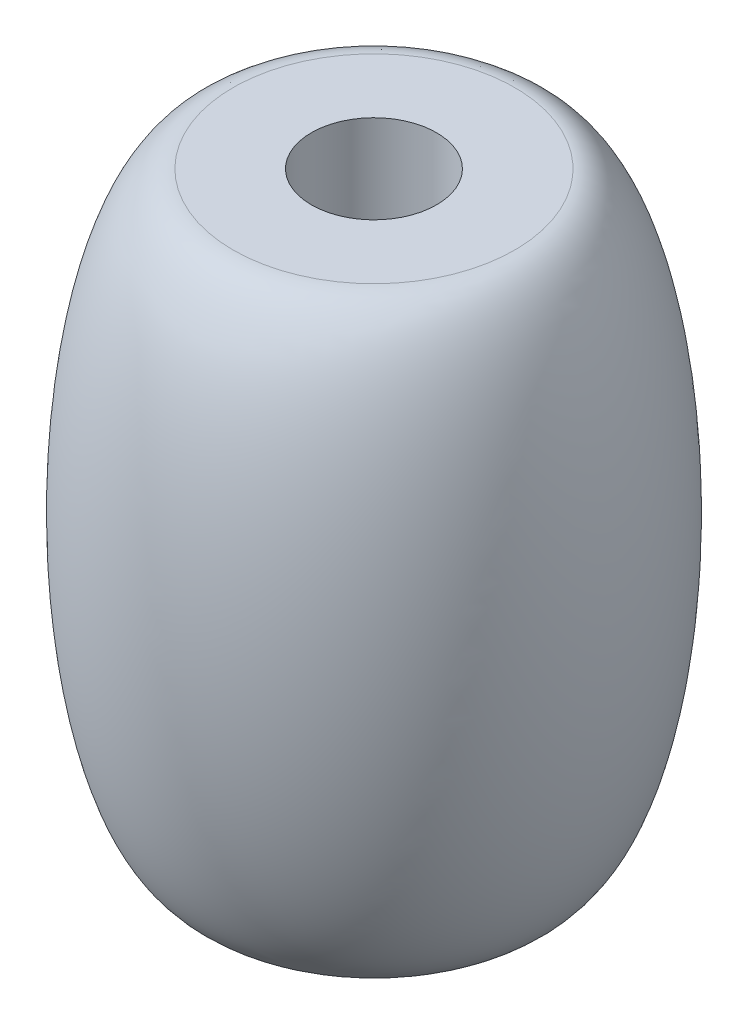
ISO-10303-21;
HEADER;
FILE_DESCRIPTION(('STEP AP214'),'2;1');
FILE_NAME('part.step','',(''),(''),'','','');
FILE_SCHEMA(('AUTOMOTIVE_DESIGN { 1 0 10303 214 1 1 1 1 }'));
ENDSEC;
DATA;
#1=APPLICATION_CONTEXT('core data for automotive mechanical design processes');
#2=APPLICATION_PROTOCOL_DEFINITION('international standard','automotive_design',2000,#1);
#3=PRODUCT_CONTEXT('',#1,'mechanical');
#4=PRODUCT('Part','Part','',(#3));
#5=PRODUCT_RELATED_PRODUCT_CATEGORY('part','',(#4));
#6=PRODUCT_DEFINITION_FORMATION('','',#4);
#7=PRODUCT_DEFINITION_CONTEXT('part definition',#1,'design');
#8=PRODUCT_DEFINITION('design','',#6,#7);
#9=PRODUCT_DEFINITION_SHAPE('','',#8);
#10=(LENGTH_UNIT() NAMED_UNIT(*) SI_UNIT(.MILLI.,.METRE.));
#11=(NAMED_UNIT(*) PLANE_ANGLE_UNIT() SI_UNIT($,.RADIAN.));
#12=(NAMED_UNIT(*) SI_UNIT($,.STERADIAN.) SOLID_ANGLE_UNIT());
#13=UNCERTAINTY_MEASURE_WITH_UNIT(LENGTH_MEASURE(1.E-05),#10,'distance_accuracy_value','');
#14=(GEOMETRIC_REPRESENTATION_CONTEXT(3) GLOBAL_UNCERTAINTY_ASSIGNED_CONTEXT((#13)) GLOBAL_UNIT_ASSIGNED_CONTEXT((#10,
#11,#12)) REPRESENTATION_CONTEXT('',''));
#15=CARTESIAN_POINT('',(0.,0.,0.));
#16=DIRECTION('',(0.,0.,1.));
#17=DIRECTION('',(1.,0.,0.));
#18=AXIS2_PLACEMENT_3D('',#15,#16,#17);
#19=CARTESIAN_POINT('',(-3.07349988963194,6.4885,0.));
#20=DIRECTION('',(0.,1.,0.));
#21=DIRECTION('',(0.,0.,1.));
#22=AXIS2_PLACEMENT_3D('',#19,#20,#21);
#23=PLANE('',#22);
#24=CARTESIAN_POINT('',(0.,6.4885,0.));
#25=DIRECTION('',(0.,1.,0.));
#26=DIRECTION('',(0.,0.,1.));
#27=AXIS2_PLACEMENT_3D('',#24,#25,#26);
#28=CIRCLE('',#27,3.07349988963194);
#29=CARTESIAN_POINT('',(0.,6.4885,3.07349988963194));
#30=VERTEX_POINT('',#29);
#31=EDGE_CURVE('E10',#30,#30,#28,.T.);
#32=ORIENTED_EDGE('',*,*,#31,.T.);
#33=EDGE_LOOP('',(#32));
#34=FACE_BOUND('',#33,.T.);
#35=CARTESIAN_POINT('',(0.,6.4885,0.));
#36=DIRECTION('',(0.,1.,0.));
#37=DIRECTION('',(0.,0.,1.));
#38=AXIS2_PLACEMENT_3D('',#35,#36,#37);
#39=CIRCLE('',#38,1.366);
#40=CARTESIAN_POINT('',(0.,6.4885,1.366));
#41=VERTEX_POINT('',#40);
#42=EDGE_CURVE('E58',#41,#41,#39,.T.);
#43=ORIENTED_EDGE('',*,*,#42,.F.);
#44=EDGE_LOOP('',(#43));
#45=FACE_BOUND('',#44,.T.);
#46=ADVANCED_FACE('F41',(#34,#45),#23,.T.);
#47=CARTESIAN_POINT('',(-3.07349996198817,0.,0.));
#48=DIRECTION('',(0.,0.,1.));
#49=DIRECTION('',(0.,-1.,0.));
#50=AXIS2_PLACEMENT_3D('',#47,#48,#49);
#51=ELLIPSE('',#50,6.4885,1.98177067184012);
#52=CARTESIAN_POINT('',(0.,10.1511574717505,0.));
#53=DIRECTION('',(0.,1.,0.));
#54=AXIS1_PLACEMENT('',#52,#53);
#55=SURFACE_OF_REVOLUTION('',#51,#54);
#56=CARTESIAN_POINT('',(0.,-6.4885,0.));
#57=DIRECTION('',(0.,1.,0.));
#58=DIRECTION('',(0.,0.,1.));
#59=AXIS2_PLACEMENT_3D('',#56,#57,#58);
#60=CIRCLE('',#59,3.07349988963194);
#61=CARTESIAN_POINT('',(0.,-6.4885,3.07349988963194));
#62=VERTEX_POINT('',#61);
#63=EDGE_CURVE('E48',#62,#62,#60,.T.);
#64=ORIENTED_EDGE('',*,*,#63,.T.);
#65=EDGE_LOOP('',(#64));
#66=FACE_BOUND('',#65,.T.);
#67=ORIENTED_EDGE('',*,*,#31,.F.);
#68=EDGE_LOOP('',(#67));
#69=FACE_BOUND('',#68,.T.);
#70=ADVANCED_FACE('F65',(#66,#69),#55,.F.);
#71=CARTESIAN_POINT('',(-1.366,-6.4885,0.));
#72=DIRECTION('',(0.,-1.,0.));
#73=DIRECTION('',(0.,0.,-1.));
#74=AXIS2_PLACEMENT_3D('',#71,#72,#73);
#75=PLANE('',#74);
#76=CARTESIAN_POINT('',(0.,-6.4885,0.));
#77=DIRECTION('',(0.,1.,0.));
#78=DIRECTION('',(0.,0.,1.));
#79=AXIS2_PLACEMENT_3D('',#76,#77,#78);
#80=CIRCLE('',#79,1.366);
#81=CARTESIAN_POINT('',(0.,-6.4885,1.366));
#82=VERTEX_POINT('',#81);
#83=EDGE_CURVE('E53',#82,#82,#80,.T.);
#84=ORIENTED_EDGE('',*,*,#83,.T.);
#85=EDGE_LOOP('',(#84));
#86=FACE_BOUND('',#85,.T.);
#87=ORIENTED_EDGE('',*,*,#63,.F.);
#88=EDGE_LOOP('',(#87));
#89=FACE_BOUND('',#88,.T.);
#90=ADVANCED_FACE('F68',(#86,#89),#75,.T.);
#91=CARTESIAN_POINT('',(0.,10.1511574717505,0.));
#92=DIRECTION('',(0.,1.,0.));
#93=DIRECTION('',(0.,0.,1.));
#94=AXIS2_PLACEMENT_3D('',#91,#92,#93);
#95=CYLINDRICAL_SURFACE('',#94,1.366);
#96=ORIENTED_EDGE('',*,*,#42,.T.);
#97=EDGE_LOOP('',(#96));
#98=FACE_BOUND('',#97,.T.);
#99=ORIENTED_EDGE('',*,*,#83,.F.);
#100=EDGE_LOOP('',(#99));
#101=FACE_BOUND('',#100,.T.);
#102=ADVANCED_FACE('F71',(#98,#101),#95,.F.);
#103=CLOSED_SHELL('',(#46,#70,#90,#102));
#104=MANIFOLD_SOLID_BREP('B2',#103);
#105=ADVANCED_BREP_SHAPE_REPRESENTATION('',(#18,#104),#14);
#106=SHAPE_DEFINITION_REPRESENTATION(#9,#105);
ENDSEC;
END-ISO-10303-21;
